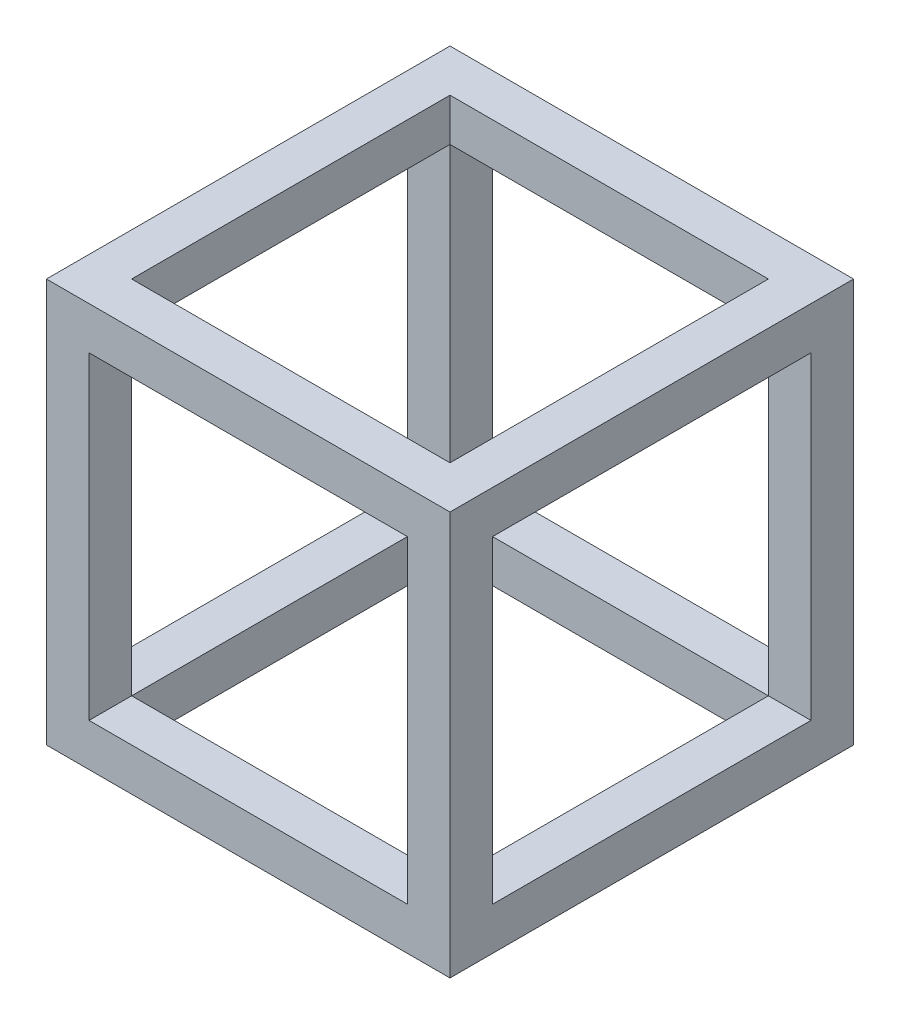
ISO-10303-21;
HEADER;
FILE_DESCRIPTION(('STEP AP214'),'2;1');
FILE_NAME('part.step','',(''),(''),'','','');
FILE_SCHEMA(('AUTOMOTIVE_DESIGN { 1 0 10303 214 1 1 1 1 }'));
ENDSEC;
DATA;
#1=APPLICATION_CONTEXT('core data for automotive mechanical design processes');
#2=APPLICATION_PROTOCOL_DEFINITION('international standard','automotive_design',2000,#1);
#3=PRODUCT_CONTEXT('',#1,'mechanical');
#4=PRODUCT('Part','Part','',(#3));
#5=PRODUCT_RELATED_PRODUCT_CATEGORY('part','',(#4));
#6=PRODUCT_DEFINITION_FORMATION('','',#4);
#7=PRODUCT_DEFINITION_CONTEXT('part definition',#1,'design');
#8=PRODUCT_DEFINITION('design','',#6,#7);
#9=PRODUCT_DEFINITION_SHAPE('','',#8);
#10=(LENGTH_UNIT() NAMED_UNIT(*) SI_UNIT(.MILLI.,.METRE.));
#11=(NAMED_UNIT(*) PLANE_ANGLE_UNIT() SI_UNIT($,.RADIAN.));
#12=(NAMED_UNIT(*) SI_UNIT($,.STERADIAN.) SOLID_ANGLE_UNIT());
#13=UNCERTAINTY_MEASURE_WITH_UNIT(LENGTH_MEASURE(1.E-05),#10,'distance_accuracy_value','');
#14=(GEOMETRIC_REPRESENTATION_CONTEXT(3) GLOBAL_UNCERTAINTY_ASSIGNED_CONTEXT((#13)) GLOBAL_UNIT_ASSIGNED_CONTEXT((#10,
#11,#12)) REPRESENTATION_CONTEXT('',''));
#15=CARTESIAN_POINT('',(0.,0.,0.));
#16=DIRECTION('',(0.,0.,1.));
#17=DIRECTION('',(1.,0.,0.));
#18=AXIS2_PLACEMENT_3D('',#15,#16,#17);
#19=CARTESIAN_POINT('',(0.,228.6,0.));
#20=DIRECTION('',(0.,1.,0.));
#21=DIRECTION('',(0.,0.,1.));
#22=AXIS2_PLACEMENT_3D('',#19,#20,#21);
#23=PLANE('',#22);
#24=DIRECTION('',(0.,0.,1.));
#25=VECTOR('',#24,1.);
#26=CARTESIAN_POINT('',(0.,228.6,0.));
#27=LINE('',#26,#25);
#28=CARTESIAN_POINT('',(0.,228.6,0.));
#29=VERTEX_POINT('',#28);
#30=CARTESIAN_POINT('',(0.,228.6,228.6));
#31=VERTEX_POINT('',#30);
#32=EDGE_CURVE('E358',#29,#31,#27,.T.);
#33=ORIENTED_EDGE('',*,*,#32,.T.);
#34=DIRECTION('',(1.,0.,0.));
#35=VECTOR('',#34,1.);
#36=CARTESIAN_POINT('',(0.,228.6,228.6));
#37=LINE('',#36,#35);
#38=CARTESIAN_POINT('',(228.6,228.6,228.6));
#39=VERTEX_POINT('',#38);
#40=EDGE_CURVE('E362',#31,#39,#37,.T.);
#41=ORIENTED_EDGE('',*,*,#40,.T.);
#42=DIRECTION('',(0.,0.,-1.));
#43=VECTOR('',#42,1.);
#44=CARTESIAN_POINT('',(228.6,228.6,0.));
#45=LINE('',#44,#43);
#46=CARTESIAN_POINT('',(228.6,228.6,0.));
#47=VERTEX_POINT('',#46);
#48=EDGE_CURVE('E366',#39,#47,#45,.T.);
#49=ORIENTED_EDGE('',*,*,#48,.T.);
#50=DIRECTION('',(-1.,0.,0.));
#51=VECTOR('',#50,1.);
#52=CARTESIAN_POINT('',(0.,228.6,0.));
#53=LINE('',#52,#51);
#54=EDGE_CURVE('E369',#47,#29,#53,.T.);
#55=ORIENTED_EDGE('',*,*,#54,.T.);
#56=EDGE_LOOP('',(#33,#41,#49,#55));
#57=FACE_BOUND('',#56,.T.);
#58=DIRECTION('',(1.,0.,0.));
#59=VECTOR('',#58,1.);
#60=CARTESIAN_POINT('',(24.13,228.6,204.47));
#61=LINE('',#60,#59);
#62=CARTESIAN_POINT('',(24.13,228.6,204.47));
#63=VERTEX_POINT('',#62);
#64=CARTESIAN_POINT('',(204.47,228.6,204.47));
#65=VERTEX_POINT('',#64);
#66=EDGE_CURVE('E193',#63,#65,#61,.T.);
#67=ORIENTED_EDGE('',*,*,#66,.F.);
#68=DIRECTION('',(0.,0.,1.));
#69=VECTOR('',#68,1.);
#70=CARTESIAN_POINT('',(24.13,228.6,24.13));
#71=LINE('',#70,#69);
#72=CARTESIAN_POINT('',(24.13,228.6,24.13));
#73=VERTEX_POINT('',#72);
#74=EDGE_CURVE('E182',#73,#63,#71,.T.);
#75=ORIENTED_EDGE('',*,*,#74,.F.);
#76=DIRECTION('',(-1.,0.,0.));
#77=VECTOR('',#76,1.);
#78=CARTESIAN_POINT('',(24.13,228.6,24.13));
#79=LINE('',#78,#77);
#80=CARTESIAN_POINT('',(204.47,228.6,24.13));
#81=VERTEX_POINT('',#80);
#82=EDGE_CURVE('E211',#81,#73,#79,.T.);
#83=ORIENTED_EDGE('',*,*,#82,.F.);
#84=DIRECTION('',(0.,0.,-1.));
#85=VECTOR('',#84,1.);
#86=CARTESIAN_POINT('',(204.47,228.6,24.13));
#87=LINE('',#86,#85);
#88=EDGE_CURVE('E207',#65,#81,#87,.T.);
#89=ORIENTED_EDGE('',*,*,#88,.F.);
#90=EDGE_LOOP('',(#67,#75,#83,#89));
#91=FACE_BOUND('',#90,.T.);
#92=ADVANCED_FACE('F43',(#57,#91),#23,.T.);
#93=CARTESIAN_POINT('',(0.,0.,0.));
#94=DIRECTION('',(0.,1.,0.));
#95=DIRECTION('',(0.,0.,1.));
#96=AXIS2_PLACEMENT_3D('',#93,#94,#95);
#97=PLANE('',#96);
#98=DIRECTION('',(0.,0.,1.));
#99=VECTOR('',#98,1.);
#100=CARTESIAN_POINT('',(0.,0.,0.));
#101=LINE('',#100,#99);
#102=CARTESIAN_POINT('',(0.,0.,0.));
#103=VERTEX_POINT('',#102);
#104=CARTESIAN_POINT('',(0.,0.,228.6));
#105=VERTEX_POINT('',#104);
#106=EDGE_CURVE('E342',#103,#105,#101,.T.);
#107=ORIENTED_EDGE('',*,*,#106,.F.);
#108=DIRECTION('',(-1.,0.,0.));
#109=VECTOR('',#108,1.);
#110=CARTESIAN_POINT('',(0.,0.,0.));
#111=LINE('',#110,#109);
#112=CARTESIAN_POINT('',(228.6,0.,0.));
#113=VERTEX_POINT('',#112);
#114=EDGE_CURVE('E363',#113,#103,#111,.T.);
#115=ORIENTED_EDGE('',*,*,#114,.F.);
#116=DIRECTION('',(0.,0.,-1.));
#117=VECTOR('',#116,1.);
#118=CARTESIAN_POINT('',(228.6,0.,0.));
#119=LINE('',#118,#117);
#120=CARTESIAN_POINT('',(228.6,0.,228.6));
#121=VERTEX_POINT('',#120);
#122=EDGE_CURVE('E379',#121,#113,#119,.T.);
#123=ORIENTED_EDGE('',*,*,#122,.F.);
#124=DIRECTION('',(1.,0.,0.));
#125=VECTOR('',#124,1.);
#126=CARTESIAN_POINT('',(0.,0.,228.6));
#127=LINE('',#126,#125);
#128=EDGE_CURVE('E376',#105,#121,#127,.T.);
#129=ORIENTED_EDGE('',*,*,#128,.F.);
#130=EDGE_LOOP('',(#107,#115,#123,#129));
#131=FACE_BOUND('',#130,.T.);
#132=DIRECTION('',(0.,0.,1.));
#133=VECTOR('',#132,1.);
#134=CARTESIAN_POINT('',(24.13,0.,24.13));
#135=LINE('',#134,#133);
#136=CARTESIAN_POINT('',(24.13,0.,24.13));
#137=VERTEX_POINT('',#136);
#138=CARTESIAN_POINT('',(24.13,0.,204.47));
#139=VERTEX_POINT('',#138);
#140=EDGE_CURVE('E67',#137,#139,#135,.T.);
#141=ORIENTED_EDGE('',*,*,#140,.T.);
#142=DIRECTION('',(1.,0.,0.));
#143=VECTOR('',#142,1.);
#144=CARTESIAN_POINT('',(24.13,0.,204.47));
#145=LINE('',#144,#143);
#146=CARTESIAN_POINT('',(204.47,0.,204.47));
#147=VERTEX_POINT('',#146);
#148=EDGE_CURVE('E219',#139,#147,#145,.T.);
#149=ORIENTED_EDGE('',*,*,#148,.T.);
#150=DIRECTION('',(0.,0.,-1.));
#151=VECTOR('',#150,1.);
#152=CARTESIAN_POINT('',(204.47,0.,24.13));
#153=LINE('',#152,#151);
#154=CARTESIAN_POINT('',(204.47,0.,24.13));
#155=VERTEX_POINT('',#154);
#156=EDGE_CURVE('E223',#147,#155,#153,.T.);
#157=ORIENTED_EDGE('',*,*,#156,.T.);
#158=DIRECTION('',(-1.,0.,0.));
#159=VECTOR('',#158,1.);
#160=CARTESIAN_POINT('',(24.13,0.,24.13));
#161=LINE('',#160,#159);
#162=EDGE_CURVE('E194',#155,#137,#161,.T.);
#163=ORIENTED_EDGE('',*,*,#162,.T.);
#164=EDGE_LOOP('',(#141,#149,#157,#163));
#165=FACE_BOUND('',#164,.T.);
#166=ADVANCED_FACE('F465',(#131,#165),#97,.F.);
#167=CARTESIAN_POINT('',(24.13,204.47,-1.2E-05));
#168=DIRECTION('',(0.,1.,0.));
#169=DIRECTION('',(0.,0.,1.));
#170=AXIS2_PLACEMENT_3D('',#167,#168,#169);
#171=PLANE('',#170);
#172=DIRECTION('',(0.,0.,-1.));
#173=VECTOR('',#172,1.);
#174=CARTESIAN_POINT('',(24.13,204.47,-1.2E-05));
#175=LINE('',#174,#173);
#176=CARTESIAN_POINT('',(24.13,204.47,204.47));
#177=VERTEX_POINT('',#176);
#178=CARTESIAN_POINT('',(24.13,204.47,24.13));
#179=VERTEX_POINT('',#178);
#180=EDGE_CURVE('E241',#177,#179,#175,.T.);
#181=ORIENTED_EDGE('',*,*,#180,.F.);
#182=DIRECTION('',(-1.,0.,0.));
#183=VECTOR('',#182,1.);
#184=CARTESIAN_POINT('',(228.6,204.47,204.47));
#185=LINE('',#184,#183);
#186=CARTESIAN_POINT('',(0.,204.47,204.47));
#187=VERTEX_POINT('',#186);
#188=EDGE_CURVE('E271',#177,#187,#185,.T.);
#189=ORIENTED_EDGE('',*,*,#188,.T.);
#190=DIRECTION('',(0.,0.,1.));
#191=VECTOR('',#190,1.);
#192=CARTESIAN_POINT('',(0.,204.47,204.47));
#193=LINE('',#192,#191);
#194=CARTESIAN_POINT('',(0.,204.47,24.13));
#195=VERTEX_POINT('',#194);
#196=EDGE_CURVE('E261',#195,#187,#193,.T.);
#197=ORIENTED_EDGE('',*,*,#196,.F.);
#198=DIRECTION('',(-1.,0.,0.));
#199=VECTOR('',#198,1.);
#200=CARTESIAN_POINT('',(228.6,204.47,24.13));
#201=LINE('',#200,#199);
#202=EDGE_CURVE('E290',#179,#195,#201,.T.);
#203=ORIENTED_EDGE('',*,*,#202,.F.);
#204=EDGE_LOOP('',(#181,#189,#197,#203));
#205=FACE_BOUND('',#204,.T.);
#206=ADVANCED_FACE('F451',(#205),#171,.F.);
#207=DIRECTION('',(-1.,0.,0.));
#208=VECTOR('',#207,1.);
#209=CARTESIAN_POINT('',(24.1300000000001,204.47,204.47));
#210=LINE('',#209,#208);
#211=CARTESIAN_POINT('',(204.47,204.47,204.47));
#212=VERTEX_POINT('',#211);
#213=EDGE_CURVE('E201',#212,#177,#210,.T.);
#214=ORIENTED_EDGE('',*,*,#213,.F.);
#215=DIRECTION('',(0.,0.,1.));
#216=VECTOR('',#215,1.);
#217=CARTESIAN_POINT('',(204.47,204.47,-1.2E-05));
#218=LINE('',#217,#216);
#219=CARTESIAN_POINT('',(204.47,204.47,228.6));
#220=VERTEX_POINT('',#219);
#221=EDGE_CURVE('E348',#212,#220,#218,.T.);
#222=ORIENTED_EDGE('',*,*,#221,.T.);
#223=DIRECTION('',(-1.,0.,0.));
#224=VECTOR('',#223,1.);
#225=CARTESIAN_POINT('',(24.13,204.47,228.6));
#226=LINE('',#225,#224);
#227=CARTESIAN_POINT('',(24.13,204.47,228.6));
#228=VERTEX_POINT('',#227);
#229=EDGE_CURVE('E333',#220,#228,#226,.T.);
#230=ORIENTED_EDGE('',*,*,#229,.T.);
#231=DIRECTION('',(0.,0.,1.));
#232=VECTOR('',#231,1.);
#233=CARTESIAN_POINT('',(24.13,204.47,-1.2E-05));
#234=LINE('',#233,#232);
#235=EDGE_CURVE('E343',#177,#228,#234,.T.);
#236=ORIENTED_EDGE('',*,*,#235,.F.);
#237=EDGE_LOOP('',(#214,#222,#230,#236));
#238=FACE_BOUND('',#237,.T.);
#239=ADVANCED_FACE('F552',(#238),#171,.F.);
#240=DIRECTION('',(0.,0.,1.));
#241=VECTOR('',#240,1.);
#242=CARTESIAN_POINT('',(204.47,204.47,-1.2E-05));
#243=LINE('',#242,#241);
#244=CARTESIAN_POINT('',(204.47,204.47,24.13));
#245=VERTEX_POINT('',#244);
#246=EDGE_CURVE('E248',#245,#212,#243,.T.);
#247=ORIENTED_EDGE('',*,*,#246,.F.);
#248=CARTESIAN_POINT('',(228.6,204.47,24.13));
#249=VERTEX_POINT('',#248);
#250=EDGE_CURVE('E291',#249,#245,#201,.T.);
#251=ORIENTED_EDGE('',*,*,#250,.F.);
#252=DIRECTION('',(0.,0.,1.));
#253=VECTOR('',#252,1.);
#254=CARTESIAN_POINT('',(228.6,204.47,204.47));
#255=LINE('',#254,#253);
#256=CARTESIAN_POINT('',(228.6,204.47,204.47));
#257=VERTEX_POINT('',#256);
#258=EDGE_CURVE('E268',#249,#257,#255,.T.);
#259=ORIENTED_EDGE('',*,*,#258,.T.);
#260=EDGE_CURVE('E286',#257,#212,#185,.T.);
#261=ORIENTED_EDGE('',*,*,#260,.T.);
#262=EDGE_LOOP('',(#247,#251,#259,#261));
#263=FACE_BOUND('',#262,.T.);
#264=ADVANCED_FACE('F547',(#263),#171,.F.);
#265=DIRECTION('',(1.,0.,0.));
#266=VECTOR('',#265,1.);
#267=CARTESIAN_POINT('',(24.13,204.47,24.13));
#268=LINE('',#267,#266);
#269=EDGE_CURVE('E251',#179,#245,#268,.T.);
#270=ORIENTED_EDGE('',*,*,#269,.F.);
#271=CARTESIAN_POINT('',(24.13,204.47,0.));
#272=VERTEX_POINT('',#271);
#273=EDGE_CURVE('E338',#272,#179,#234,.T.);
#274=ORIENTED_EDGE('',*,*,#273,.F.);
#275=DIRECTION('',(-1.,0.,0.));
#276=VECTOR('',#275,1.);
#277=CARTESIAN_POINT('',(0.,204.47,0.));
#278=LINE('',#277,#276);
#279=CARTESIAN_POINT('',(204.47,204.47,0.));
#280=VERTEX_POINT('',#279);
#281=EDGE_CURVE('E407',#280,#272,#278,.T.);
#282=ORIENTED_EDGE('',*,*,#281,.F.);
#283=EDGE_CURVE('E344',#280,#245,#218,.T.);
#284=ORIENTED_EDGE('',*,*,#283,.T.);
#285=EDGE_LOOP('',(#270,#274,#282,#284));
#286=FACE_BOUND('',#285,.T.);
#287=ADVANCED_FACE('F446',(#286),#171,.F.);
#288=CARTESIAN_POINT('',(24.1300000000001,24.13,-1.2E-05));
#289=DIRECTION('',(0.,-1.,0.));
#290=DIRECTION('',(1.,0.,0.));
#291=AXIS2_PLACEMENT_3D('',#288,#289,#290);
#292=PLANE('',#291);
#293=DIRECTION('',(0.,0.,1.));
#294=VECTOR('',#293,1.);
#295=CARTESIAN_POINT('',(24.13,24.13,-1.2E-05));
#296=LINE('',#295,#294);
#297=CARTESIAN_POINT('',(24.13,24.13,24.13));
#298=VERTEX_POINT('',#297);
#299=CARTESIAN_POINT('',(24.13,24.13,204.47));
#300=VERTEX_POINT('',#299);
#301=EDGE_CURVE('E203',#298,#300,#296,.T.);
#302=ORIENTED_EDGE('',*,*,#301,.F.);
#303=DIRECTION('',(-1.,0.,0.));
#304=VECTOR('',#303,1.);
#305=CARTESIAN_POINT('',(228.6,24.13,24.13));
#306=LINE('',#305,#304);
#307=CARTESIAN_POINT('',(0.,24.13,24.13));
#308=VERTEX_POINT('',#307);
#309=EDGE_CURVE('E295',#298,#308,#306,.T.);
#310=ORIENTED_EDGE('',*,*,#309,.T.);
#311=DIRECTION('',(0.,0.,-1.));
#312=VECTOR('',#311,1.);
#313=CARTESIAN_POINT('',(0.,24.13,204.47));
#314=LINE('',#313,#312);
#315=CARTESIAN_POINT('',(0.,24.13,204.47));
#316=VERTEX_POINT('',#315);
#317=EDGE_CURVE('E275',#316,#308,#314,.T.);
#318=ORIENTED_EDGE('',*,*,#317,.F.);
#319=DIRECTION('',(-1.,0.,0.));
#320=VECTOR('',#319,1.);
#321=CARTESIAN_POINT('',(228.6,24.13,204.47));
#322=LINE('',#321,#320);
#323=EDGE_CURVE('E300',#300,#316,#322,.T.);
#324=ORIENTED_EDGE('',*,*,#323,.F.);
#325=EDGE_LOOP('',(#302,#310,#318,#324));
#326=FACE_BOUND('',#325,.T.);
#327=ADVANCED_FACE('F427',(#326),#292,.F.);
#328=DIRECTION('',(1.,0.,0.));
#329=VECTOR('',#328,1.);
#330=CARTESIAN_POINT('',(24.1300000000001,24.13,204.47));
#331=LINE('',#330,#329);
#332=CARTESIAN_POINT('',(204.47,24.13,204.47));
#333=VERTEX_POINT('',#332);
#334=EDGE_CURVE('E11',#300,#333,#331,.T.);
#335=ORIENTED_EDGE('',*,*,#334,.F.);
#336=DIRECTION('',(0.,0.,1.));
#337=VECTOR('',#336,1.);
#338=CARTESIAN_POINT('',(24.1300000000001,24.13,-1.2E-05));
#339=LINE('',#338,#337);
#340=CARTESIAN_POINT('',(24.1300000000001,24.13,228.6));
#341=VERTEX_POINT('',#340);
#342=EDGE_CURVE('E337',#300,#341,#339,.T.);
#343=ORIENTED_EDGE('',*,*,#342,.T.);
#344=DIRECTION('',(1.,0.,0.));
#345=VECTOR('',#344,1.);
#346=CARTESIAN_POINT('',(24.1300000000001,24.13,228.6));
#347=LINE('',#346,#345);
#348=CARTESIAN_POINT('',(204.47,24.13,228.6));
#349=VERTEX_POINT('',#348);
#350=EDGE_CURVE('E325',#341,#349,#347,.T.);
#351=ORIENTED_EDGE('',*,*,#350,.T.);
#352=DIRECTION('',(0.,0.,1.));
#353=VECTOR('',#352,1.);
#354=CARTESIAN_POINT('',(204.47,24.13,-1.2E-05));
#355=LINE('',#354,#353);
#356=EDGE_CURVE('E353',#333,#349,#355,.T.);
#357=ORIENTED_EDGE('',*,*,#356,.F.);
#358=EDGE_LOOP('',(#335,#343,#351,#357));
#359=FACE_BOUND('',#358,.T.);
#360=ADVANCED_FACE('F485',(#359),#292,.F.);
#361=DIRECTION('',(0.,0.,-1.));
#362=VECTOR('',#361,1.);
#363=CARTESIAN_POINT('',(204.47,24.13,-1.2E-05));
#364=LINE('',#363,#362);
#365=CARTESIAN_POINT('',(204.47,24.13,24.13));
#366=VERTEX_POINT('',#365);
#367=EDGE_CURVE('E244',#333,#366,#364,.T.);
#368=ORIENTED_EDGE('',*,*,#367,.F.);
#369=CARTESIAN_POINT('',(228.6,24.13,204.47));
#370=VERTEX_POINT('',#369);
#371=EDGE_CURVE('E301',#370,#333,#322,.T.);
#372=ORIENTED_EDGE('',*,*,#371,.F.);
#373=DIRECTION('',(0.,0.,-1.));
#374=VECTOR('',#373,1.);
#375=CARTESIAN_POINT('',(228.6,24.13,204.47));
#376=LINE('',#375,#374);
#377=CARTESIAN_POINT('',(228.6,24.13,24.13));
#378=VERTEX_POINT('',#377);
#379=EDGE_CURVE('E260',#370,#378,#376,.T.);
#380=ORIENTED_EDGE('',*,*,#379,.T.);
#381=EDGE_CURVE('E296',#378,#366,#306,.T.);
#382=ORIENTED_EDGE('',*,*,#381,.T.);
#383=EDGE_LOOP('',(#368,#372,#380,#382));
#384=FACE_BOUND('',#383,.T.);
#385=ADVANCED_FACE('F472',(#384),#292,.F.);
#386=DIRECTION('',(-1.,0.,0.));
#387=VECTOR('',#386,1.);
#388=CARTESIAN_POINT('',(24.1300000000001,24.13,24.13));
#389=LINE('',#388,#387);
#390=EDGE_CURVE('E52',#366,#298,#389,.T.);
#391=ORIENTED_EDGE('',*,*,#390,.F.);
#392=CARTESIAN_POINT('',(204.47,24.13,0.));
#393=VERTEX_POINT('',#392);
#394=EDGE_CURVE('E349',#393,#366,#355,.T.);
#395=ORIENTED_EDGE('',*,*,#394,.F.);
#396=DIRECTION('',(1.,0.,0.));
#397=VECTOR('',#396,1.);
#398=CARTESIAN_POINT('',(0.,24.13,0.));
#399=LINE('',#398,#397);
#400=CARTESIAN_POINT('',(24.1300000000001,24.13,0.));
#401=VERTEX_POINT('',#400);
#402=EDGE_CURVE('E399',#401,#393,#399,.T.);
#403=ORIENTED_EDGE('',*,*,#402,.F.);
#404=EDGE_CURVE('E354',#401,#298,#339,.T.);
#405=ORIENTED_EDGE('',*,*,#404,.T.);
#406=EDGE_LOOP('',(#391,#395,#403,#405));
#407=FACE_BOUND('',#406,.T.);
#408=ADVANCED_FACE('F439',(#407),#292,.F.);
#409=CARTESIAN_POINT('',(0.,228.6,0.));
#410=DIRECTION('',(1.,0.,0.));
#411=DIRECTION('',(0.,0.,-1.));
#412=AXIS2_PLACEMENT_3D('',#409,#410,#411);
#413=PLANE('',#412);
#414=ORIENTED_EDGE('',*,*,#106,.T.);
#415=DIRECTION('',(0.,-1.,0.));
#416=VECTOR('',#415,1.);
#417=CARTESIAN_POINT('',(0.,228.6,228.6));
#418=LINE('',#417,#416);
#419=EDGE_CURVE('E395',#31,#105,#418,.T.);
#420=ORIENTED_EDGE('',*,*,#419,.F.);
#421=ORIENTED_EDGE('',*,*,#32,.F.);
#422=DIRECTION('',(0.,-1.,0.));
#423=VECTOR('',#422,1.);
#424=CARTESIAN_POINT('',(0.,228.6,0.));
#425=LINE('',#424,#423);
#426=EDGE_CURVE('E372',#29,#103,#425,.T.);
#427=ORIENTED_EDGE('',*,*,#426,.T.);
#428=EDGE_LOOP('',(#414,#420,#421,#427));
#429=FACE_BOUND('',#428,.T.);
#430=DIRECTION('',(0.,-1.,0.));
#431=VECTOR('',#430,1.);
#432=CARTESIAN_POINT('',(0.,204.47,204.47));
#433=LINE('',#432,#431);
#434=EDGE_CURVE('E256',#187,#316,#433,.T.);
#435=ORIENTED_EDGE('',*,*,#434,.T.);
#436=ORIENTED_EDGE('',*,*,#317,.T.);
#437=DIRECTION('',(0.,1.,0.));
#438=VECTOR('',#437,1.);
#439=CARTESIAN_POINT('',(0.,204.47,24.13));
#440=LINE('',#439,#438);
#441=EDGE_CURVE('E279',#308,#195,#440,.T.);
#442=ORIENTED_EDGE('',*,*,#441,.T.);
#443=ORIENTED_EDGE('',*,*,#196,.T.);
#444=EDGE_LOOP('',(#435,#436,#442,#443));
#445=FACE_BOUND('',#444,.T.);
#446=ADVANCED_FACE('F45',(#429,#445),#413,.F.);
#447=CARTESIAN_POINT('',(228.6,228.6,0.));
#448=DIRECTION('',(-1.,0.,0.));
#449=DIRECTION('',(0.,0.,1.));
#450=AXIS2_PLACEMENT_3D('',#447,#448,#449);
#451=PLANE('',#450);
#452=ORIENTED_EDGE('',*,*,#122,.T.);
#453=DIRECTION('',(0.,-1.,0.));
#454=VECTOR('',#453,1.);
#455=CARTESIAN_POINT('',(228.6,228.6,0.));
#456=LINE('',#455,#454);
#457=EDGE_CURVE('E387',#47,#113,#456,.T.);
#458=ORIENTED_EDGE('',*,*,#457,.F.);
#459=ORIENTED_EDGE('',*,*,#48,.F.);
#460=DIRECTION('',(0.,-1.,0.));
#461=VECTOR('',#460,1.);
#462=CARTESIAN_POINT('',(228.6,228.6,228.6));
#463=LINE('',#462,#461);
#464=EDGE_CURVE('E391',#39,#121,#463,.T.);
#465=ORIENTED_EDGE('',*,*,#464,.T.);
#466=EDGE_LOOP('',(#452,#458,#459,#465));
#467=FACE_BOUND('',#466,.T.);
#468=DIRECTION('',(0.,-1.,0.));
#469=VECTOR('',#468,1.);
#470=CARTESIAN_POINT('',(228.6,204.47,204.47));
#471=LINE('',#470,#469);
#472=EDGE_CURVE('E257',#257,#370,#471,.T.);
#473=ORIENTED_EDGE('',*,*,#472,.F.);
#474=ORIENTED_EDGE('',*,*,#258,.F.);
#475=DIRECTION('',(0.,1.,0.));
#476=VECTOR('',#475,1.);
#477=CARTESIAN_POINT('',(228.6,204.47,24.13));
#478=LINE('',#477,#476);
#479=EDGE_CURVE('E264',#378,#249,#478,.T.);
#480=ORIENTED_EDGE('',*,*,#479,.F.);
#481=ORIENTED_EDGE('',*,*,#379,.F.);
#482=EDGE_LOOP('',(#473,#474,#480,#481));
#483=FACE_BOUND('',#482,.T.);
#484=ADVANCED_FACE('F497',(#467,#483),#451,.F.);
#485=CARTESIAN_POINT('',(24.13,204.47,-1.2E-05));
#486=DIRECTION('',(-1.,0.,0.));
#487=DIRECTION('',(0.,-1.,0.));
#488=AXIS2_PLACEMENT_3D('',#485,#486,#487);
#489=PLANE('',#488);
#490=DIRECTION('',(0.,-1.,0.));
#491=VECTOR('',#490,1.);
#492=CARTESIAN_POINT('',(24.13,204.47,204.47));
#493=LINE('',#492,#491);
#494=EDGE_CURVE('E317',#177,#300,#493,.T.);
#495=ORIENTED_EDGE('',*,*,#494,.F.);
#496=ORIENTED_EDGE('',*,*,#235,.T.);
#497=DIRECTION('',(0.,-1.,0.));
#498=VECTOR('',#497,1.);
#499=CARTESIAN_POINT('',(24.13,204.47,228.6));
#500=LINE('',#499,#498);
#501=EDGE_CURVE('E321',#228,#341,#500,.T.);
#502=ORIENTED_EDGE('',*,*,#501,.T.);
#503=ORIENTED_EDGE('',*,*,#342,.F.);
#504=EDGE_LOOP('',(#495,#496,#502,#503));
#505=FACE_BOUND('',#504,.T.);
#506=ADVANCED_FACE('F503',(#505),#489,.F.);
#507=DIRECTION('',(0.,1.,0.));
#508=VECTOR('',#507,1.);
#509=CARTESIAN_POINT('',(24.13,204.47,24.13));
#510=LINE('',#509,#508);
#511=EDGE_CURVE('E309',#298,#179,#510,.T.);
#512=ORIENTED_EDGE('',*,*,#511,.F.);
#513=ORIENTED_EDGE('',*,*,#404,.F.);
#514=DIRECTION('',(0.,-1.,0.));
#515=VECTOR('',#514,1.);
#516=CARTESIAN_POINT('',(24.13,228.6,0.));
#517=LINE('',#516,#515);
#518=EDGE_CURVE('E411',#272,#401,#517,.T.);
#519=ORIENTED_EDGE('',*,*,#518,.F.);
#520=ORIENTED_EDGE('',*,*,#273,.T.);
#521=EDGE_LOOP('',(#512,#513,#519,#520));
#522=FACE_BOUND('',#521,.T.);
#523=ADVANCED_FACE('F437',(#522),#489,.F.);
#524=CARTESIAN_POINT('',(204.47,204.47,-1.2E-05));
#525=DIRECTION('',(1.,0.,0.));
#526=DIRECTION('',(0.,0.,-1.));
#527=AXIS2_PLACEMENT_3D('',#524,#525,#526);
#528=PLANE('',#527);
#529=DIRECTION('',(0.,1.,0.));
#530=VECTOR('',#529,1.);
#531=CARTESIAN_POINT('',(204.47,204.47,204.47));
#532=LINE('',#531,#530);
#533=EDGE_CURVE('E313',#333,#212,#532,.T.);
#534=ORIENTED_EDGE('',*,*,#533,.F.);
#535=ORIENTED_EDGE('',*,*,#356,.T.);
#536=DIRECTION('',(0.,1.,0.));
#537=VECTOR('',#536,1.);
#538=CARTESIAN_POINT('',(204.47,204.47,228.6));
#539=LINE('',#538,#537);
#540=EDGE_CURVE('E329',#349,#220,#539,.T.);
#541=ORIENTED_EDGE('',*,*,#540,.T.);
#542=ORIENTED_EDGE('',*,*,#221,.F.);
#543=EDGE_LOOP('',(#534,#535,#541,#542));
#544=FACE_BOUND('',#543,.T.);
#545=ADVANCED_FACE('F483',(#544),#528,.F.);
#546=DIRECTION('',(0.,-1.,0.));
#547=VECTOR('',#546,1.);
#548=CARTESIAN_POINT('',(204.47,204.47,24.13));
#549=LINE('',#548,#547);
#550=EDGE_CURVE('E305',#245,#366,#549,.T.);
#551=ORIENTED_EDGE('',*,*,#550,.F.);
#552=ORIENTED_EDGE('',*,*,#283,.F.);
#553=DIRECTION('',(0.,1.,0.));
#554=VECTOR('',#553,1.);
#555=CARTESIAN_POINT('',(204.47,228.6,0.));
#556=LINE('',#555,#554);
#557=EDGE_CURVE('E403',#393,#280,#556,.T.);
#558=ORIENTED_EDGE('',*,*,#557,.F.);
#559=ORIENTED_EDGE('',*,*,#394,.T.);
#560=EDGE_LOOP('',(#551,#552,#558,#559));
#561=FACE_BOUND('',#560,.T.);
#562=ADVANCED_FACE('F521',(#561),#528,.F.);
#563=CARTESIAN_POINT('',(0.,228.6,228.6));
#564=DIRECTION('',(0.,0.,-1.));
#565=DIRECTION('',(-1.,0.,0.));
#566=AXIS2_PLACEMENT_3D('',#563,#564,#565);
#567=PLANE('',#566);
#568=ORIENTED_EDGE('',*,*,#350,.F.);
#569=ORIENTED_EDGE('',*,*,#501,.F.);
#570=ORIENTED_EDGE('',*,*,#229,.F.);
#571=ORIENTED_EDGE('',*,*,#540,.F.);
#572=EDGE_LOOP('',(#568,#569,#570,#571));
#573=FACE_BOUND('',#572,.T.);
#574=ORIENTED_EDGE('',*,*,#128,.T.);
#575=ORIENTED_EDGE('',*,*,#464,.F.);
#576=ORIENTED_EDGE('',*,*,#40,.F.);
#577=ORIENTED_EDGE('',*,*,#419,.T.);
#578=EDGE_LOOP('',(#574,#575,#576,#577));
#579=FACE_BOUND('',#578,.T.);
#580=ADVANCED_FACE('F519',(#573,#579),#567,.F.);
#581=CARTESIAN_POINT('',(0.,228.6,0.));
#582=DIRECTION('',(0.,0.,1.));
#583=DIRECTION('',(1.,0.,0.));
#584=AXIS2_PLACEMENT_3D('',#581,#582,#583);
#585=PLANE('',#584);
#586=ORIENTED_EDGE('',*,*,#281,.T.);
#587=ORIENTED_EDGE('',*,*,#518,.T.);
#588=ORIENTED_EDGE('',*,*,#402,.T.);
#589=ORIENTED_EDGE('',*,*,#557,.T.);
#590=EDGE_LOOP('',(#586,#587,#588,#589));
#591=FACE_BOUND('',#590,.T.);
#592=ORIENTED_EDGE('',*,*,#114,.T.);
#593=ORIENTED_EDGE('',*,*,#426,.F.);
#594=ORIENTED_EDGE('',*,*,#54,.F.);
#595=ORIENTED_EDGE('',*,*,#457,.T.);
#596=EDGE_LOOP('',(#592,#593,#594,#595));
#597=FACE_BOUND('',#596,.T.);
#598=ADVANCED_FACE('F442',(#591,#597),#585,.F.);
#599=CARTESIAN_POINT('',(228.6,204.47,24.13));
#600=DIRECTION('',(0.,0.,1.));
#601=DIRECTION('',(1.,0.,0.));
#602=AXIS2_PLACEMENT_3D('',#599,#600,#601);
#603=PLANE('',#602);
#604=ORIENTED_EDGE('',*,*,#550,.T.);
#605=ORIENTED_EDGE('',*,*,#381,.F.);
#606=ORIENTED_EDGE('',*,*,#479,.T.);
#607=ORIENTED_EDGE('',*,*,#250,.T.);
#608=EDGE_LOOP('',(#604,#605,#606,#607));
#609=FACE_BOUND('',#608,.T.);
#610=ADVANCED_FACE('F518',(#609),#603,.T.);
#611=CARTESIAN_POINT('',(228.6,204.47,204.47));
#612=DIRECTION('',(0.,0.,-1.));
#613=DIRECTION('',(-1.,0.,0.));
#614=AXIS2_PLACEMENT_3D('',#611,#612,#613);
#615=PLANE('',#614);
#616=ORIENTED_EDGE('',*,*,#533,.T.);
#617=ORIENTED_EDGE('',*,*,#260,.F.);
#618=ORIENTED_EDGE('',*,*,#472,.T.);
#619=ORIENTED_EDGE('',*,*,#371,.T.);
#620=EDGE_LOOP('',(#616,#617,#618,#619));
#621=FACE_BOUND('',#620,.T.);
#622=ADVANCED_FACE('F477',(#621),#615,.T.);
#623=ORIENTED_EDGE('',*,*,#494,.T.);
#624=ORIENTED_EDGE('',*,*,#323,.T.);
#625=ORIENTED_EDGE('',*,*,#434,.F.);
#626=ORIENTED_EDGE('',*,*,#188,.F.);
#627=EDGE_LOOP('',(#623,#624,#625,#626));
#628=FACE_BOUND('',#627,.T.);
#629=ADVANCED_FACE('F493',(#628),#615,.T.);
#630=ORIENTED_EDGE('',*,*,#511,.T.);
#631=ORIENTED_EDGE('',*,*,#202,.T.);
#632=ORIENTED_EDGE('',*,*,#441,.F.);
#633=ORIENTED_EDGE('',*,*,#309,.F.);
#634=EDGE_LOOP('',(#630,#631,#632,#633));
#635=FACE_BOUND('',#634,.T.);
#636=ADVANCED_FACE('F433',(#635),#603,.T.);
#637=CARTESIAN_POINT('',(24.13,228.6,24.13));
#638=DIRECTION('',(0.,0.,1.));
#639=DIRECTION('',(1.,0.,0.));
#640=AXIS2_PLACEMENT_3D('',#637,#638,#639);
#641=PLANE('',#640);
#642=ORIENTED_EDGE('',*,*,#390,.T.);
#643=DIRECTION('',(0.,-1.,0.));
#644=VECTOR('',#643,1.);
#645=CARTESIAN_POINT('',(24.13,228.6,24.13));
#646=LINE('',#645,#644);
#647=EDGE_CURVE('E216',#298,#137,#646,.T.);
#648=ORIENTED_EDGE('',*,*,#647,.T.);
#649=ORIENTED_EDGE('',*,*,#162,.F.);
#650=DIRECTION('',(0.,-1.,0.));
#651=VECTOR('',#650,1.);
#652=CARTESIAN_POINT('',(204.47,228.6,24.13));
#653=LINE('',#652,#651);
#654=EDGE_CURVE('E232',#366,#155,#653,.T.);
#655=ORIENTED_EDGE('',*,*,#654,.F.);
#656=EDGE_LOOP('',(#642,#648,#649,#655));
#657=FACE_BOUND('',#656,.T.);
#658=ADVANCED_FACE('F417',(#657),#641,.T.);
#659=CARTESIAN_POINT('',(204.47,228.6,24.13));
#660=DIRECTION('',(-1.,0.,0.));
#661=DIRECTION('',(0.,0.,1.));
#662=AXIS2_PLACEMENT_3D('',#659,#660,#661);
#663=PLANE('',#662);
#664=ORIENTED_EDGE('',*,*,#367,.T.);
#665=ORIENTED_EDGE('',*,*,#654,.T.);
#666=ORIENTED_EDGE('',*,*,#156,.F.);
#667=DIRECTION('',(0.,-1.,0.));
#668=VECTOR('',#667,1.);
#669=CARTESIAN_POINT('',(204.47,228.6,204.47));
#670=LINE('',#669,#668);
#671=EDGE_CURVE('E235',#333,#147,#670,.T.);
#672=ORIENTED_EDGE('',*,*,#671,.F.);
#673=EDGE_LOOP('',(#664,#665,#666,#672));
#674=FACE_BOUND('',#673,.T.);
#675=ADVANCED_FACE('F461',(#674),#663,.T.);
#676=CARTESIAN_POINT('',(24.13,228.6,204.47));
#677=DIRECTION('',(0.,0.,-1.));
#678=DIRECTION('',(-1.,0.,0.));
#679=AXIS2_PLACEMENT_3D('',#676,#677,#678);
#680=PLANE('',#679);
#681=ORIENTED_EDGE('',*,*,#334,.T.);
#682=ORIENTED_EDGE('',*,*,#671,.T.);
#683=ORIENTED_EDGE('',*,*,#148,.F.);
#684=DIRECTION('',(0.,-1.,0.));
#685=VECTOR('',#684,1.);
#686=CARTESIAN_POINT('',(24.13,228.6,204.47));
#687=LINE('',#686,#685);
#688=EDGE_CURVE('E204',#300,#139,#687,.T.);
#689=ORIENTED_EDGE('',*,*,#688,.F.);
#690=EDGE_LOOP('',(#681,#682,#683,#689));
#691=FACE_BOUND('',#690,.T.);
#692=ADVANCED_FACE('F468',(#691),#680,.T.);
#693=CARTESIAN_POINT('',(24.13,228.6,24.13));
#694=DIRECTION('',(1.,0.,0.));
#695=DIRECTION('',(0.,0.,-1.));
#696=AXIS2_PLACEMENT_3D('',#693,#694,#695);
#697=PLANE('',#696);
#698=ORIENTED_EDGE('',*,*,#301,.T.);
#699=ORIENTED_EDGE('',*,*,#688,.T.);
#700=ORIENTED_EDGE('',*,*,#140,.F.);
#701=ORIENTED_EDGE('',*,*,#647,.F.);
#702=EDGE_LOOP('',(#698,#699,#700,#701));
#703=FACE_BOUND('',#702,.T.);
#704=ADVANCED_FACE('F421',(#703),#697,.T.);
#705=ORIENTED_EDGE('',*,*,#213,.T.);
#706=EDGE_CURVE('E186',#63,#177,#687,.T.);
#707=ORIENTED_EDGE('',*,*,#706,.F.);
#708=ORIENTED_EDGE('',*,*,#66,.T.);
#709=EDGE_CURVE('E236',#65,#212,#670,.T.);
#710=ORIENTED_EDGE('',*,*,#709,.T.);
#711=EDGE_LOOP('',(#705,#707,#708,#710));
#712=FACE_BOUND('',#711,.T.);
#713=ADVANCED_FACE('F197',(#712),#680,.T.);
#714=ORIENTED_EDGE('',*,*,#269,.T.);
#715=EDGE_CURVE('E59',#81,#245,#653,.T.);
#716=ORIENTED_EDGE('',*,*,#715,.F.);
#717=ORIENTED_EDGE('',*,*,#82,.T.);
#718=EDGE_CURVE('E188',#73,#179,#646,.T.);
#719=ORIENTED_EDGE('',*,*,#718,.T.);
#720=EDGE_LOOP('',(#714,#716,#717,#719));
#721=FACE_BOUND('',#720,.T.);
#722=ADVANCED_FACE('F677',(#721),#641,.T.);
#723=ORIENTED_EDGE('',*,*,#246,.T.);
#724=ORIENTED_EDGE('',*,*,#709,.F.);
#725=ORIENTED_EDGE('',*,*,#88,.T.);
#726=ORIENTED_EDGE('',*,*,#715,.T.);
#727=EDGE_LOOP('',(#723,#724,#725,#726));
#728=FACE_BOUND('',#727,.T.);
#729=ADVANCED_FACE('F549',(#728),#663,.T.);
#730=ORIENTED_EDGE('',*,*,#180,.T.);
#731=ORIENTED_EDGE('',*,*,#718,.F.);
#732=ORIENTED_EDGE('',*,*,#74,.T.);
#733=ORIENTED_EDGE('',*,*,#706,.T.);
#734=EDGE_LOOP('',(#730,#731,#732,#733));
#735=FACE_BOUND('',#734,.T.);
#736=ADVANCED_FACE('F185',(#735),#697,.T.);
#737=CLOSED_SHELL('',(#92,#166,#206,#239,#264,#287,#327,#360,#385,#408,#446,#484,#506,#523,#545,
#562,#580,#598,#610,#622,#629,#636,#658,#675,#692,#704,#713,#722,#729,#736));
#738=MANIFOLD_SOLID_BREP('B2',#737);
#739=ADVANCED_BREP_SHAPE_REPRESENTATION('',(#18,#738),#14);
#740=SHAPE_DEFINITION_REPRESENTATION(#9,#739);
ENDSEC;
END-ISO-10303-21;
